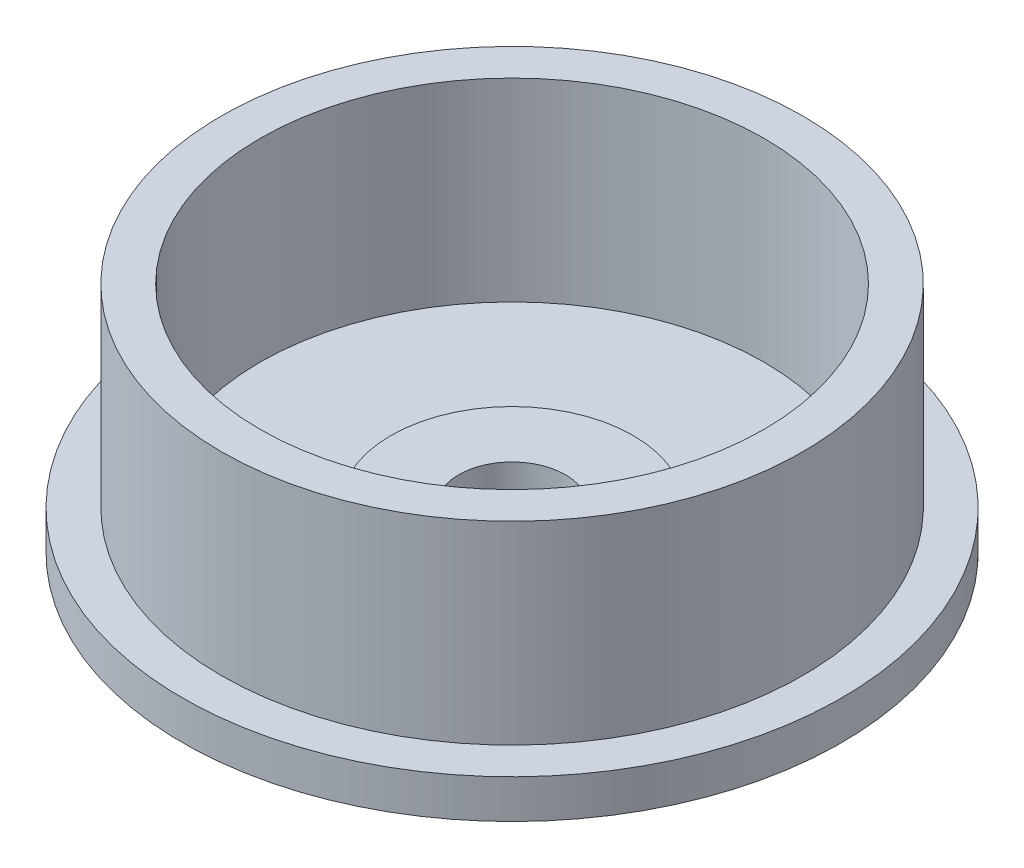
ISO-10303-21;
HEADER;
FILE_DESCRIPTION(('STEP AP214'),'2;1');
FILE_NAME('part.step','',(''),(''),'','','');
FILE_SCHEMA(('AUTOMOTIVE_DESIGN { 1 0 10303 214 1 1 1 1 }'));
ENDSEC;
DATA;
#1=APPLICATION_CONTEXT('core data for automotive mechanical design processes');
#2=APPLICATION_PROTOCOL_DEFINITION('international standard','automotive_design',2000,#1);
#3=PRODUCT_CONTEXT('',#1,'mechanical');
#4=PRODUCT('Part','Part','',(#3));
#5=PRODUCT_RELATED_PRODUCT_CATEGORY('part','',(#4));
#6=PRODUCT_DEFINITION_FORMATION('','',#4);
#7=PRODUCT_DEFINITION_CONTEXT('part definition',#1,'design');
#8=PRODUCT_DEFINITION('design','',#6,#7);
#9=PRODUCT_DEFINITION_SHAPE('','',#8);
#10=(LENGTH_UNIT() NAMED_UNIT(*) SI_UNIT(.MILLI.,.METRE.));
#11=(NAMED_UNIT(*) PLANE_ANGLE_UNIT() SI_UNIT($,.RADIAN.));
#12=(NAMED_UNIT(*) SI_UNIT($,.STERADIAN.) SOLID_ANGLE_UNIT());
#13=UNCERTAINTY_MEASURE_WITH_UNIT(LENGTH_MEASURE(1.E-05),#10,'distance_accuracy_value','');
#14=(GEOMETRIC_REPRESENTATION_CONTEXT(3) GLOBAL_UNCERTAINTY_ASSIGNED_CONTEXT((#13)) GLOBAL_UNIT_ASSIGNED_CONTEXT((#10,
#11,#12)) REPRESENTATION_CONTEXT('',''));
#15=CARTESIAN_POINT('',(0.,0.,0.));
#16=DIRECTION('',(0.,0.,1.));
#17=DIRECTION('',(1.,0.,0.));
#18=AXIS2_PLACEMENT_3D('',#15,#16,#17);
#19=CARTESIAN_POINT('',(0.,2.,0.));
#20=DIRECTION('',(0.,1.,0.));
#21=DIRECTION('',(0.,0.,1.));
#22=AXIS2_PLACEMENT_3D('',#19,#20,#21);
#23=PLANE('',#22);
#24=CARTESIAN_POINT('',(0.,2.,0.));
#25=DIRECTION('',(0.,1.,0.));
#26=DIRECTION('',(0.,0.,1.));
#27=AXIS2_PLACEMENT_3D('',#24,#25,#26);
#28=CIRCLE('',#27,13.);
#29=CARTESIAN_POINT('',(0.,2.,13.));
#30=VERTEX_POINT('',#29);
#31=EDGE_CURVE('E55',#30,#30,#28,.T.);
#32=ORIENTED_EDGE('',*,*,#31,.T.);
#33=EDGE_LOOP('',(#32));
#34=FACE_BOUND('',#33,.T.);
#35=CARTESIAN_POINT('',(0.,2.,0.));
#36=DIRECTION('',(0.,1.,0.));
#37=DIRECTION('',(0.,0.,1.));
#38=AXIS2_PLACEMENT_3D('',#35,#36,#37);
#39=CIRCLE('',#38,6.25);
#40=CARTESIAN_POINT('',(0.,2.,6.25));
#41=VERTEX_POINT('',#40);
#42=EDGE_CURVE('E73',#41,#41,#39,.T.);
#43=ORIENTED_EDGE('',*,*,#42,.F.);
#44=EDGE_LOOP('',(#43));
#45=FACE_BOUND('',#44,.T.);
#46=ADVANCED_FACE('F35',(#34,#45),#23,.T.);
#47=CARTESIAN_POINT('',(0.,0.,0.));
#48=DIRECTION('',(0.,1.,0.));
#49=DIRECTION('',(0.,0.,1.));
#50=AXIS2_PLACEMENT_3D('',#47,#48,#49);
#51=PLANE('',#50);
#52=CARTESIAN_POINT('',(0.,0.,0.));
#53=DIRECTION('',(0.,-1.,0.));
#54=DIRECTION('',(0.,0.,-1.));
#55=AXIS2_PLACEMENT_3D('',#52,#53,#54);
#56=CIRCLE('',#55,17.);
#57=CARTESIAN_POINT('',(0.,0.,-17.));
#58=VERTEX_POINT('',#57);
#59=EDGE_CURVE('E59',#58,#58,#56,.T.);
#60=ORIENTED_EDGE('',*,*,#59,.T.);
#61=EDGE_LOOP('',(#60));
#62=FACE_BOUND('',#61,.T.);
#63=CARTESIAN_POINT('',(0.,0.,0.));
#64=DIRECTION('',(0.,1.,0.));
#65=DIRECTION('',(0.,0.,1.));
#66=AXIS2_PLACEMENT_3D('',#63,#64,#65);
#67=CIRCLE('',#66,4.25);
#68=CARTESIAN_POINT('',(0.,0.,4.25));
#69=VERTEX_POINT('',#68);
#70=EDGE_CURVE('E11',#69,#69,#67,.F.);
#71=ORIENTED_EDGE('',*,*,#70,.F.);
#72=EDGE_LOOP('',(#71));
#73=FACE_BOUND('',#72,.T.);
#74=ADVANCED_FACE('F83',(#62,#73),#51,.F.);
#75=CARTESIAN_POINT('',(0.,12.,0.));
#76=DIRECTION('',(0.,-1.,0.));
#77=DIRECTION('',(0.,0.,-1.));
#78=AXIS2_PLACEMENT_3D('',#75,#76,#77);
#79=CYLINDRICAL_SURFACE('',#78,15.);
#80=CARTESIAN_POINT('',(0.,12.,0.));
#81=DIRECTION('',(0.,1.,0.));
#82=DIRECTION('',(0.,0.,1.));
#83=AXIS2_PLACEMENT_3D('',#80,#81,#82);
#84=CIRCLE('',#83,15.);
#85=CARTESIAN_POINT('',(0.,12.,15.));
#86=VERTEX_POINT('',#85);
#87=EDGE_CURVE('E46',#86,#86,#84,.T.);
#88=ORIENTED_EDGE('',*,*,#87,.F.);
#89=EDGE_LOOP('',(#88));
#90=FACE_BOUND('',#89,.T.);
#91=CARTESIAN_POINT('',(0.,2.,0.));
#92=DIRECTION('',(0.,-1.,0.));
#93=DIRECTION('',(0.,0.,-1.));
#94=AXIS2_PLACEMENT_3D('',#91,#92,#93);
#95=CIRCLE('',#94,15.);
#96=CARTESIAN_POINT('',(0.,2.,-15.));
#97=VERTEX_POINT('',#96);
#98=EDGE_CURVE('E42',#97,#97,#95,.T.);
#99=ORIENTED_EDGE('',*,*,#98,.F.);
#100=EDGE_LOOP('',(#99));
#101=FACE_BOUND('',#100,.T.);
#102=ADVANCED_FACE('F37',(#90,#101),#79,.T.);
#103=CARTESIAN_POINT('',(0.,12.,0.));
#104=DIRECTION('',(0.,1.,0.));
#105=DIRECTION('',(0.,0.,1.));
#106=AXIS2_PLACEMENT_3D('',#103,#104,#105);
#107=PLANE('',#106);
#108=CARTESIAN_POINT('',(0.,12.,0.));
#109=DIRECTION('',(0.,1.,0.));
#110=DIRECTION('',(0.,0.,1.));
#111=AXIS2_PLACEMENT_3D('',#108,#109,#110);
#112=CIRCLE('',#111,13.);
#113=CARTESIAN_POINT('',(0.,12.,13.));
#114=VERTEX_POINT('',#113);
#115=EDGE_CURVE('E50',#114,#114,#112,.T.);
#116=ORIENTED_EDGE('',*,*,#115,.F.);
#117=EDGE_LOOP('',(#116));
#118=FACE_BOUND('',#117,.T.);
#119=ORIENTED_EDGE('',*,*,#87,.T.);
#120=EDGE_LOOP('',(#119));
#121=FACE_BOUND('',#120,.T.);
#122=ADVANCED_FACE('F94',(#118,#121),#107,.T.);
#123=CARTESIAN_POINT('',(0.,12.,0.));
#124=DIRECTION('',(0.,-1.,0.));
#125=DIRECTION('',(0.,0.,-1.));
#126=AXIS2_PLACEMENT_3D('',#123,#124,#125);
#127=CYLINDRICAL_SURFACE('',#126,13.);
#128=ORIENTED_EDGE('',*,*,#115,.T.);
#129=EDGE_LOOP('',(#128));
#130=FACE_BOUND('',#129,.T.);
#131=ORIENTED_EDGE('',*,*,#31,.F.);
#132=EDGE_LOOP('',(#131));
#133=FACE_BOUND('',#132,.T.);
#134=ADVANCED_FACE('F92',(#130,#133),#127,.F.);
#135=CARTESIAN_POINT('',(0.,12.,0.));
#136=DIRECTION('',(0.,-1.,0.));
#137=DIRECTION('',(0.,0.,-1.));
#138=AXIS2_PLACEMENT_3D('',#135,#136,#137);
#139=CYLINDRICAL_SURFACE('',#138,2.75);
#140=CARTESIAN_POINT('',(0.,-4.4,0.));
#141=DIRECTION('',(0.,-1.,0.));
#142=DIRECTION('',(0.,0.,-1.));
#143=AXIS2_PLACEMENT_3D('',#140,#141,#142);
#144=CIRCLE('',#143,2.75);
#145=CARTESIAN_POINT('',(0.,-4.4,-2.75));
#146=VERTEX_POINT('',#145);
#147=EDGE_CURVE('E67',#146,#146,#144,.T.);
#148=ORIENTED_EDGE('',*,*,#147,.T.);
#149=EDGE_LOOP('',(#148));
#150=FACE_BOUND('',#149,.T.);
#151=CARTESIAN_POINT('',(0.,2.1,0.));
#152=DIRECTION('',(0.,-1.,0.));
#153=DIRECTION('',(0.,0.,-1.));
#154=AXIS2_PLACEMENT_3D('',#151,#152,#153);
#155=CIRCLE('',#154,2.75);
#156=CARTESIAN_POINT('',(0.,2.1,-2.75));
#157=VERTEX_POINT('',#156);
#158=EDGE_CURVE('E70',#157,#157,#155,.T.);
#159=ORIENTED_EDGE('',*,*,#158,.F.);
#160=EDGE_LOOP('',(#159));
#161=FACE_BOUND('',#160,.T.);
#162=ADVANCED_FACE('F101',(#150,#161),#139,.F.);
#163=CARTESIAN_POINT('',(0.,2.,0.));
#164=DIRECTION('',(0.,-1.,0.));
#165=DIRECTION('',(0.,0.,-1.));
#166=AXIS2_PLACEMENT_3D('',#163,#164,#165);
#167=CYLINDRICAL_SURFACE('',#166,17.);
#168=CARTESIAN_POINT('',(0.,2.,0.));
#169=DIRECTION('',(0.,-1.,0.));
#170=DIRECTION('',(0.,0.,-1.));
#171=AXIS2_PLACEMENT_3D('',#168,#169,#170);
#172=CIRCLE('',#171,17.);
#173=CARTESIAN_POINT('',(0.,2.,-17.));
#174=VERTEX_POINT('',#173);
#175=EDGE_CURVE('E58',#174,#174,#172,.T.);
#176=ORIENTED_EDGE('',*,*,#175,.T.);
#177=EDGE_LOOP('',(#176));
#178=FACE_BOUND('',#177,.T.);
#179=ORIENTED_EDGE('',*,*,#59,.F.);
#180=EDGE_LOOP('',(#179));
#181=FACE_BOUND('',#180,.T.);
#182=ADVANCED_FACE('F159',(#178,#181),#167,.T.);
#183=CARTESIAN_POINT('',(0.,2.,0.));
#184=DIRECTION('',(0.,-1.,0.));
#185=DIRECTION('',(0.,0.,-1.));
#186=AXIS2_PLACEMENT_3D('',#183,#184,#185);
#187=PLANE('',#186);
#188=ORIENTED_EDGE('',*,*,#98,.T.);
#189=EDGE_LOOP('',(#188));
#190=FACE_BOUND('',#189,.T.);
#191=ORIENTED_EDGE('',*,*,#175,.F.);
#192=EDGE_LOOP('',(#191));
#193=FACE_BOUND('',#192,.T.);
#194=ADVANCED_FACE('F126',(#190,#193),#187,.F.);
#195=CARTESIAN_POINT('',(0.,-4.4,0.));
#196=DIRECTION('',(0.,-1.,0.));
#197=DIRECTION('',(0.,0.,-1.));
#198=AXIS2_PLACEMENT_3D('',#195,#196,#197);
#199=PLANE('',#198);
#200=CARTESIAN_POINT('',(0.,-4.4,0.));
#201=DIRECTION('',(0.,-1.,0.));
#202=DIRECTION('',(0.,0.,-1.));
#203=AXIS2_PLACEMENT_3D('',#200,#201,#202);
#204=CIRCLE('',#203,4.25);
#205=CARTESIAN_POINT('',(0.,-4.4,-4.25));
#206=VERTEX_POINT('',#205);
#207=EDGE_CURVE('E62',#206,#206,#204,.T.);
#208=ORIENTED_EDGE('',*,*,#207,.T.);
#209=EDGE_LOOP('',(#208));
#210=FACE_BOUND('',#209,.T.);
#211=ORIENTED_EDGE('',*,*,#147,.F.);
#212=EDGE_LOOP('',(#211));
#213=FACE_BOUND('',#212,.T.);
#214=ADVANCED_FACE('F130',(#210,#213),#199,.T.);
#215=CARTESIAN_POINT('',(0.,-4.4,0.));
#216=DIRECTION('',(0.,1.,0.));
#217=DIRECTION('',(0.,0.,1.));
#218=AXIS2_PLACEMENT_3D('',#215,#216,#217);
#219=CYLINDRICAL_SURFACE('',#218,4.25);
#220=ORIENTED_EDGE('',*,*,#207,.F.);
#221=EDGE_LOOP('',(#220));
#222=FACE_BOUND('',#221,.T.);
#223=ORIENTED_EDGE('',*,*,#70,.T.);
#224=EDGE_LOOP('',(#223));
#225=FACE_BOUND('',#224,.T.);
#226=ADVANCED_FACE('F135',(#222,#225),#219,.T.);
#227=CARTESIAN_POINT('',(0.,26.2776695296637,0.));
#228=DIRECTION('',(0.,-1.,0.));
#229=DIRECTION('',(0.,0.,-1.));
#230=AXIS2_PLACEMENT_3D('',#227,#228,#229);
#231=CYLINDRICAL_SURFACE('',#230,6.25);
#232=CARTESIAN_POINT('',(0.,2.1,0.));
#233=DIRECTION('',(0.,-1.,0.));
#234=DIRECTION('',(0.,0.,-1.));
#235=AXIS2_PLACEMENT_3D('',#232,#233,#234);
#236=CIRCLE('',#235,6.25);
#237=CARTESIAN_POINT('',(0.,2.1,-6.25));
#238=VERTEX_POINT('',#237);
#239=EDGE_CURVE('E74',#238,#238,#236,.T.);
#240=ORIENTED_EDGE('',*,*,#239,.T.);
#241=EDGE_LOOP('',(#240));
#242=FACE_BOUND('',#241,.T.);
#243=ORIENTED_EDGE('',*,*,#42,.T.);
#244=EDGE_LOOP('',(#243));
#245=FACE_BOUND('',#244,.T.);
#246=ADVANCED_FACE('F80',(#242,#245),#231,.T.);
#247=CARTESIAN_POINT('',(0.,2.1,0.));
#248=DIRECTION('',(0.,-1.,0.));
#249=DIRECTION('',(0.,0.,-1.));
#250=AXIS2_PLACEMENT_3D('',#247,#248,#249);
#251=PLANE('',#250);
#252=ORIENTED_EDGE('',*,*,#158,.T.);
#253=EDGE_LOOP('',(#252));
#254=FACE_BOUND('',#253,.T.);
#255=ORIENTED_EDGE('',*,*,#239,.F.);
#256=EDGE_LOOP('',(#255));
#257=FACE_BOUND('',#256,.T.);
#258=ADVANCED_FACE('F168',(#254,#257),#251,.F.);
#259=CLOSED_SHELL('',(#46,#74,#102,#122,#134,#162,#182,#194,#214,#226,#246,#258));
#260=MANIFOLD_SOLID_BREP('B2',#259);
#261=ADVANCED_BREP_SHAPE_REPRESENTATION('',(#18,#260),#14);
#262=SHAPE_DEFINITION_REPRESENTATION(#9,#261);
ENDSEC;
END-ISO-10303-21;
